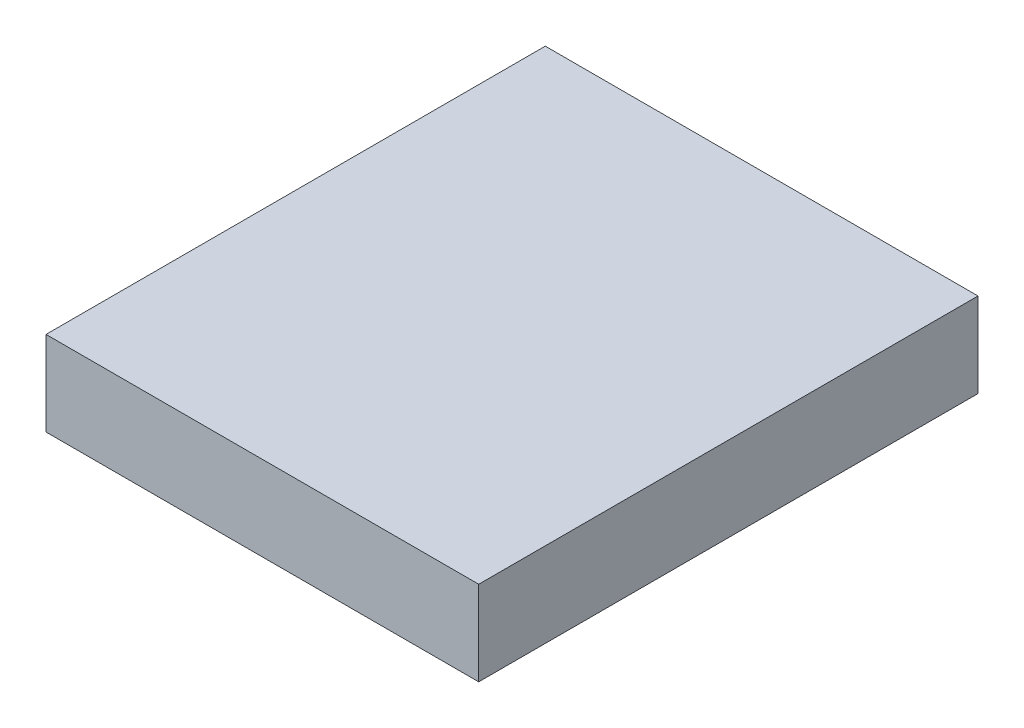
ISO-10303-21;
HEADER;
FILE_DESCRIPTION(('STEP AP214'),'2;1');
FILE_NAME('part.step','',(''),(''),'','','');
FILE_SCHEMA(('AUTOMOTIVE_DESIGN { 1 0 10303 214 1 1 1 1 }'));
ENDSEC;
DATA;
#1=APPLICATION_CONTEXT('core data for automotive mechanical design processes');
#2=APPLICATION_PROTOCOL_DEFINITION('international standard','automotive_design',2000,#1);
#3=PRODUCT_CONTEXT('',#1,'mechanical');
#4=PRODUCT('Part','Part','',(#3));
#5=PRODUCT_RELATED_PRODUCT_CATEGORY('part','',(#4));
#6=PRODUCT_DEFINITION_FORMATION('','',#4);
#7=PRODUCT_DEFINITION_CONTEXT('part definition',#1,'design');
#8=PRODUCT_DEFINITION('design','',#6,#7);
#9=PRODUCT_DEFINITION_SHAPE('','',#8);
#10=(LENGTH_UNIT() NAMED_UNIT(*) SI_UNIT(.MILLI.,.METRE.));
#11=(NAMED_UNIT(*) PLANE_ANGLE_UNIT() SI_UNIT($,.RADIAN.));
#12=(NAMED_UNIT(*) SI_UNIT($,.STERADIAN.) SOLID_ANGLE_UNIT());
#13=UNCERTAINTY_MEASURE_WITH_UNIT(LENGTH_MEASURE(1.E-05),#10,'distance_accuracy_value','');
#14=(GEOMETRIC_REPRESENTATION_CONTEXT(3) GLOBAL_UNCERTAINTY_ASSIGNED_CONTEXT((#13)) GLOBAL_UNIT_ASSIGNED_CONTEXT((#10,
#11,#12)) REPRESENTATION_CONTEXT('',''));
#15=CARTESIAN_POINT('',(0.,0.,0.));
#16=DIRECTION('',(0.,0.,1.));
#17=DIRECTION('',(1.,0.,0.));
#18=AXIS2_PLACEMENT_3D('',#15,#16,#17);
#19=CARTESIAN_POINT('',(-65.,25.4,0.));
#20=DIRECTION('',(1.,0.,0.));
#21=DIRECTION('',(0.,0.,-1.));
#22=AXIS2_PLACEMENT_3D('',#19,#20,#21);
#23=PLANE('',#22);
#24=DIRECTION('',(0.,0.,1.));
#25=VECTOR('',#24,1.);
#26=CARTESIAN_POINT('',(-65.,0.,0.));
#27=LINE('',#26,#25);
#28=CARTESIAN_POINT('',(-65.,0.,0.));
#29=VERTEX_POINT('',#28);
#30=CARTESIAN_POINT('',(-65.,0.,150.));
#31=VERTEX_POINT('',#30);
#32=EDGE_CURVE('E97',#29,#31,#27,.T.);
#33=ORIENTED_EDGE('',*,*,#32,.T.);
#34=DIRECTION('',(0.,-1.,0.));
#35=VECTOR('',#34,1.);
#36=CARTESIAN_POINT('',(-65.,25.4,150.));
#37=LINE('',#36,#35);
#38=CARTESIAN_POINT('',(-65.,25.4,150.));
#39=VERTEX_POINT('',#38);
#40=EDGE_CURVE('E11',#39,#31,#37,.T.);
#41=ORIENTED_EDGE('',*,*,#40,.F.);
#42=DIRECTION('',(0.,0.,1.));
#43=VECTOR('',#42,1.);
#44=CARTESIAN_POINT('',(-65.,25.4,0.));
#45=LINE('',#44,#43);
#46=CARTESIAN_POINT('',(-65.,25.4,0.));
#47=VERTEX_POINT('',#46);
#48=EDGE_CURVE('E85',#47,#39,#45,.T.);
#49=ORIENTED_EDGE('',*,*,#48,.F.);
#50=DIRECTION('',(0.,-1.,0.));
#51=VECTOR('',#50,1.);
#52=CARTESIAN_POINT('',(-65.,25.4,0.));
#53=LINE('',#52,#51);
#54=EDGE_CURVE('E93',#47,#29,#53,.T.);
#55=ORIENTED_EDGE('',*,*,#54,.T.);
#56=EDGE_LOOP('',(#33,#41,#49,#55));
#57=FACE_BOUND('',#56,.T.);
#58=ADVANCED_FACE('F34',(#57),#23,.F.);
#59=CARTESIAN_POINT('',(-65.,25.4,150.));
#60=DIRECTION('',(0.,0.,-1.));
#61=DIRECTION('',(-1.,0.,0.));
#62=AXIS2_PLACEMENT_3D('',#59,#60,#61);
#63=PLANE('',#62);
#64=DIRECTION('',(1.,0.,0.));
#65=VECTOR('',#64,1.);
#66=CARTESIAN_POINT('',(-65.,0.,150.));
#67=LINE('',#66,#65);
#68=CARTESIAN_POINT('',(65.,0.,150.));
#69=VERTEX_POINT('',#68);
#70=EDGE_CURVE('E89',#31,#69,#67,.T.);
#71=ORIENTED_EDGE('',*,*,#70,.T.);
#72=DIRECTION('',(0.,-1.,0.));
#73=VECTOR('',#72,1.);
#74=CARTESIAN_POINT('',(65.,25.4,150.));
#75=LINE('',#74,#73);
#76=CARTESIAN_POINT('',(65.,25.4,150.));
#77=VERTEX_POINT('',#76);
#78=EDGE_CURVE('E42',#77,#69,#75,.T.);
#79=ORIENTED_EDGE('',*,*,#78,.F.);
#80=DIRECTION('',(1.,0.,0.));
#81=VECTOR('',#80,1.);
#82=CARTESIAN_POINT('',(-65.,25.4,150.));
#83=LINE('',#82,#81);
#84=EDGE_CURVE('E80',#39,#77,#83,.T.);
#85=ORIENTED_EDGE('',*,*,#84,.F.);
#86=ORIENTED_EDGE('',*,*,#40,.T.);
#87=EDGE_LOOP('',(#71,#79,#85,#86));
#88=FACE_BOUND('',#87,.T.);
#89=ADVANCED_FACE('F88',(#88),#63,.F.);
#90=CARTESIAN_POINT('',(65.,25.4,0.));
#91=DIRECTION('',(-1.,0.,0.));
#92=DIRECTION('',(0.,0.,1.));
#93=AXIS2_PLACEMENT_3D('',#90,#91,#92);
#94=PLANE('',#93);
#95=DIRECTION('',(0.,0.,-1.));
#96=VECTOR('',#95,1.);
#97=CARTESIAN_POINT('',(65.,0.,0.));
#98=LINE('',#97,#96);
#99=CARTESIAN_POINT('',(65.,0.,0.));
#100=VERTEX_POINT('',#99);
#101=EDGE_CURVE('E67',#69,#100,#98,.T.);
#102=ORIENTED_EDGE('',*,*,#101,.T.);
#103=DIRECTION('',(0.,-1.,0.));
#104=VECTOR('',#103,1.);
#105=CARTESIAN_POINT('',(65.,25.4,0.));
#106=LINE('',#105,#104);
#107=CARTESIAN_POINT('',(65.,25.4,0.));
#108=VERTEX_POINT('',#107);
#109=EDGE_CURVE('E90',#108,#100,#106,.T.);
#110=ORIENTED_EDGE('',*,*,#109,.F.);
#111=DIRECTION('',(0.,0.,-1.));
#112=VECTOR('',#111,1.);
#113=CARTESIAN_POINT('',(65.,25.4,0.));
#114=LINE('',#113,#112);
#115=EDGE_CURVE('E83',#77,#108,#114,.T.);
#116=ORIENTED_EDGE('',*,*,#115,.F.);
#117=ORIENTED_EDGE('',*,*,#78,.T.);
#118=EDGE_LOOP('',(#102,#110,#116,#117));
#119=FACE_BOUND('',#118,.T.);
#120=ADVANCED_FACE('F91',(#119),#94,.F.);
#121=CARTESIAN_POINT('',(-65.,25.4,0.));
#122=DIRECTION('',(0.,0.,1.));
#123=DIRECTION('',(1.,0.,0.));
#124=AXIS2_PLACEMENT_3D('',#121,#122,#123);
#125=PLANE('',#124);
#126=DIRECTION('',(-1.,0.,0.));
#127=VECTOR('',#126,1.);
#128=CARTESIAN_POINT('',(-65.,0.,0.));
#129=LINE('',#128,#127);
#130=EDGE_CURVE('E73',#100,#29,#129,.T.);
#131=ORIENTED_EDGE('',*,*,#130,.T.);
#132=ORIENTED_EDGE('',*,*,#54,.F.);
#133=DIRECTION('',(-1.,0.,0.));
#134=VECTOR('',#133,1.);
#135=CARTESIAN_POINT('',(-65.,25.4,0.));
#136=LINE('',#135,#134);
#137=EDGE_CURVE('E50',#108,#47,#136,.T.);
#138=ORIENTED_EDGE('',*,*,#137,.F.);
#139=ORIENTED_EDGE('',*,*,#109,.T.);
#140=EDGE_LOOP('',(#131,#132,#138,#139));
#141=FACE_BOUND('',#140,.T.);
#142=ADVANCED_FACE('F104',(#141),#125,.F.);
#143=CARTESIAN_POINT('',(0.,25.4,0.));
#144=DIRECTION('',(0.,1.,0.));
#145=DIRECTION('',(0.,0.,1.));
#146=AXIS2_PLACEMENT_3D('',#143,#144,#145);
#147=PLANE('',#146);
#148=ORIENTED_EDGE('',*,*,#48,.T.);
#149=ORIENTED_EDGE('',*,*,#84,.T.);
#150=ORIENTED_EDGE('',*,*,#115,.T.);
#151=ORIENTED_EDGE('',*,*,#137,.T.);
#152=EDGE_LOOP('',(#148,#149,#150,#151));
#153=FACE_BOUND('',#152,.T.);
#154=ADVANCED_FACE('F81',(#153),#147,.T.);
#155=CARTESIAN_POINT('',(0.,0.,0.));
#156=DIRECTION('',(0.,1.,0.));
#157=DIRECTION('',(0.,0.,1.));
#158=AXIS2_PLACEMENT_3D('',#155,#156,#157);
#159=PLANE('',#158);
#160=ORIENTED_EDGE('',*,*,#32,.F.);
#161=ORIENTED_EDGE('',*,*,#130,.F.);
#162=ORIENTED_EDGE('',*,*,#101,.F.);
#163=ORIENTED_EDGE('',*,*,#70,.F.);
#164=EDGE_LOOP('',(#160,#161,#162,#163));
#165=FACE_BOUND('',#164,.T.);
#166=ADVANCED_FACE('F107',(#165),#159,.F.);
#167=CLOSED_SHELL('',(#58,#89,#120,#142,#154,#166));
#168=MANIFOLD_SOLID_BREP('B2',#167);
#169=ADVANCED_BREP_SHAPE_REPRESENTATION('',(#18,#168),#14);
#170=SHAPE_DEFINITION_REPRESENTATION(#9,#169);
ENDSEC;
END-ISO-10303-21;
